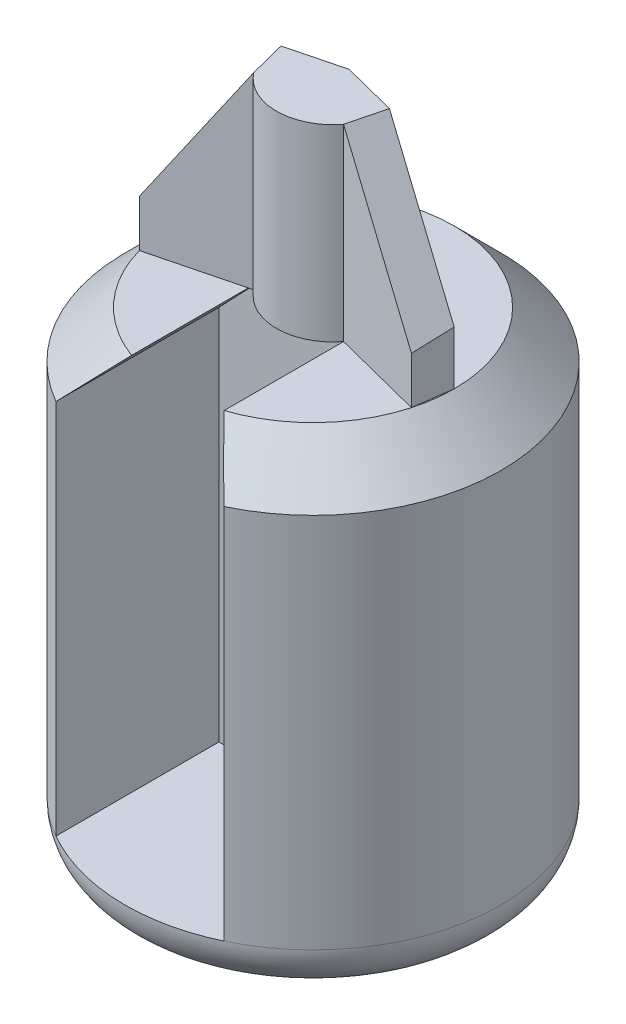
ISO-10303-21;
HEADER;
FILE_DESCRIPTION(('STEP AP214'),'2;1');
FILE_NAME('part.step','',(''),(''),'','','');
FILE_SCHEMA(('AUTOMOTIVE_DESIGN { 1 0 10303 214 1 1 1 1 }'));
ENDSEC;
DATA;
#1=APPLICATION_CONTEXT('core data for automotive mechanical design processes');
#2=APPLICATION_PROTOCOL_DEFINITION('international standard','automotive_design',2000,#1);
#3=PRODUCT_CONTEXT('',#1,'mechanical');
#4=PRODUCT('Part','Part','',(#3));
#5=PRODUCT_RELATED_PRODUCT_CATEGORY('part','',(#4));
#6=PRODUCT_DEFINITION_FORMATION('','',#4);
#7=PRODUCT_DEFINITION_CONTEXT('part definition',#1,'design');
#8=PRODUCT_DEFINITION('design','',#6,#7);
#9=PRODUCT_DEFINITION_SHAPE('','',#8);
#10=(LENGTH_UNIT() NAMED_UNIT(*) SI_UNIT(.MILLI.,.METRE.));
#11=(NAMED_UNIT(*) PLANE_ANGLE_UNIT() SI_UNIT($,.RADIAN.));
#12=(NAMED_UNIT(*) SI_UNIT($,.STERADIAN.) SOLID_ANGLE_UNIT());
#13=UNCERTAINTY_MEASURE_WITH_UNIT(LENGTH_MEASURE(1.E-05),#10,'distance_accuracy_value','');
#14=(GEOMETRIC_REPRESENTATION_CONTEXT(3) GLOBAL_UNCERTAINTY_ASSIGNED_CONTEXT((#13)) GLOBAL_UNIT_ASSIGNED_CONTEXT((#10,
#11,#12)) REPRESENTATION_CONTEXT('',''));
#15=CARTESIAN_POINT('',(0.,0.,0.));
#16=DIRECTION('',(0.,0.,1.));
#17=DIRECTION('',(1.,0.,0.));
#18=AXIS2_PLACEMENT_3D('',#15,#16,#17);
#19=CARTESIAN_POINT('',(0.,127.,0.));
#20=DIRECTION('',(0.,1.,0.));
#21=DIRECTION('',(0.,0.,1.));
#22=AXIS2_PLACEMENT_3D('',#19,#20,#21);
#23=PLANE('',#22);
#24=DIRECTION('',(0.96893064681082,0.,0.247332573008017));
#25=VECTOR('',#24,1.);
#26=CARTESIAN_POINT('',(0.,127.,0.786640961524415));
#27=LINE('',#26,#25);
#28=CARTESIAN_POINT('',(12.1095143174718,127.,3.87775728019579));
#29=VERTEX_POINT('',#28);
#30=CARTESIAN_POINT('',(36.7203527464664,127.,10.1600046345994));
#31=VERTEX_POINT('',#30);
#32=EDGE_CURVE('E211',#29,#31,#27,.T.);
#33=ORIENTED_EDGE('',*,*,#32,.F.);
#34=DIRECTION('',(0.,0.,-1.));
#35=VECTOR('',#34,1.);
#36=CARTESIAN_POINT('',(12.1095143174718,127.,50.801));
#37=LINE('',#36,#35);
#38=CARTESIAN_POINT('',(12.1095143174718,127.,36.1243638420796));
#39=VERTEX_POINT('',#38);
#40=EDGE_CURVE('E257',#39,#29,#37,.T.);
#41=ORIENTED_EDGE('',*,*,#40,.F.);
#42=CARTESIAN_POINT('',(0.,127.,0.));
#43=DIRECTION('',(0.,1.,0.));
#44=DIRECTION('',(0.,0.,1.));
#45=AXIS2_PLACEMENT_3D('',#42,#43,#44);
#46=CIRCLE('',#45,38.1);
#47=EDGE_CURVE('E189',#39,#31,#46,.T.);
#48=ORIENTED_EDGE('',*,*,#47,.T.);
#49=EDGE_LOOP('',(#33,#41,#48));
#50=FACE_BOUND('',#49,.T.);
#51=ADVANCED_FACE('F38',(#50),#23,.T.);
#52=CARTESIAN_POINT('',(-36.7203527464669,127.,10.1600046345976));
#53=VERTEX_POINT('',#52);
#54=CARTESIAN_POINT('',(-13.2904856825282,127.,35.7067639295767));
#55=VERTEX_POINT('',#54);
#56=EDGE_CURVE('E376',#53,#55,#46,.T.);
#57=ORIENTED_EDGE('',*,*,#56,.T.);
#58=DIRECTION('',(0.,0.,-1.));
#59=VECTOR('',#58,1.);
#60=CARTESIAN_POINT('',(-13.2904856825282,127.,50.801));
#61=LINE('',#60,#59);
#62=CARTESIAN_POINT('',(-13.2904856825282,127.,4.17921609701575));
#63=VERTEX_POINT('',#62);
#64=EDGE_CURVE('E152',#55,#63,#61,.T.);
#65=ORIENTED_EDGE('',*,*,#64,.T.);
#66=DIRECTION('',(0.96893064681082,0.,-0.247332573008019));
#67=VECTOR('',#66,1.);
#68=CARTESIAN_POINT('',(-36.7203527464666,127.,10.1600046345995));
#69=LINE('',#68,#67);
#70=EDGE_CURVE('E214',#53,#63,#69,.T.);
#71=ORIENTED_EDGE('',*,*,#70,.F.);
#72=EDGE_LOOP('',(#57,#65,#71));
#73=FACE_BOUND('',#72,.T.);
#74=ADVANCED_FACE('F327',(#73),#23,.T.);
#75=CARTESIAN_POINT('',(0.,127.,0.));
#76=DIRECTION('',(0.,-1.,0.));
#77=DIRECTION('',(0.,0.,-1.));
#78=AXIS2_PLACEMENT_3D('',#75,#76,#77);
#79=CYLINDRICAL_SURFACE('',#78,50.8);
#80=DIRECTION('',(0.,-1.,0.));
#81=VECTOR('',#80,1.);
#82=CARTESIAN_POINT('',(-25.4,127.,43.9940905122495));
#83=LINE('',#82,#81);
#84=CARTESIAN_POINT('',(-25.4,12.7,43.9940905122495));
#85=VERTEX_POINT('',#84);
#86=CARTESIAN_POINT('',(-25.4,114.3,43.9940905122495));
#87=VERTEX_POINT('',#86);
#88=EDGE_CURVE('E164',#85,#87,#83,.F.);
#89=ORIENTED_EDGE('',*,*,#88,.T.);
#90=CARTESIAN_POINT('',(0.,114.3,0.));
#91=DIRECTION('',(0.,1.,0.));
#92=DIRECTION('',(0.,0.,1.));
#93=AXIS2_PLACEMENT_3D('',#90,#91,#92);
#94=CIRCLE('',#93,50.8);
#95=CARTESIAN_POINT('',(21.8199678159868,114.3,45.8751458254827));
#96=VERTEX_POINT('',#95);
#97=EDGE_CURVE('E176',#87,#96,#94,.F.);
#98=ORIENTED_EDGE('',*,*,#97,.T.);
#99=DIRECTION('',(0.,-1.,0.));
#100=VECTOR('',#99,1.);
#101=CARTESIAN_POINT('',(21.8199678159868,127.,45.8751458254827));
#102=LINE('',#101,#100);
#103=CARTESIAN_POINT('',(21.8199678159868,12.7,45.8751458254827));
#104=VERTEX_POINT('',#103);
#105=EDGE_CURVE('E255',#96,#104,#102,.T.);
#106=ORIENTED_EDGE('',*,*,#105,.T.);
#107=CARTESIAN_POINT('',(0.,12.7,0.));
#108=DIRECTION('',(0.,1.,0.));
#109=DIRECTION('',(0.,0.,1.));
#110=AXIS2_PLACEMENT_3D('',#107,#108,#109);
#111=CIRCLE('',#110,50.8);
#112=EDGE_CURVE('E178',#104,#85,#111,.T.);
#113=ORIENTED_EDGE('',*,*,#112,.T.);
#114=EDGE_LOOP('',(#89,#98,#106,#113));
#115=FACE_BOUND('',#114,.T.);
#116=ADVANCED_FACE('F174',(#115),#79,.T.);
#117=CARTESIAN_POINT('',(0.,127.,0.));
#118=DIRECTION('',(0.,-1.,0.));
#119=DIRECTION('',(0.,0.,-1.));
#120=AXIS2_PLACEMENT_3D('',#117,#118,#119);
#121=CONICAL_SURFACE('',#120,38.1,0.785398163397445);
#122=ORIENTED_EDGE('',*,*,#47,.F.);
#123=CARTESIAN_POINT('',(21.8201207365143,114.2998,45.8752945612771));
#124=CARTESIAN_POINT('',(21.0039980457926,115.367181474382,45.0814372184799));
#125=CARTESIAN_POINT('',(20.1891992180709,116.432831509537,44.2838706233484));
#126=CARTESIAN_POINT('',(18.5628632959826,118.559865660278,42.6799618756017));
#127=CARTESIAN_POINT('',(17.7513260054679,119.6212500324,41.8736202618639));
#128=CARTESIAN_POINT('',(16.1320092203815,121.739104072249,40.2506896394883));
#129=CARTESIAN_POINT('',(15.3242298103603,122.795573629396,39.4341004017976));
#130=CARTESIAN_POINT('',(14.1159486519419,124.375846962074,38.2001376166085));
#131=CARTESIAN_POINT('',(13.7137405002434,124.90188248939,37.7872905849943));
#132=CARTESIAN_POINT('',(12.910579325713,125.95231200003,36.9582942072156));
#133=CARTESIAN_POINT('',(12.5096263087185,126.476705975719,36.5421448457243));
#134=CARTESIAN_POINT('',(12.1093613969443,127.0002,36.1242041656034));
#135=B_SPLINE_CURVE_WITH_KNOTS('',3,(#123,#124,#125,#126,#127,#128,#129,#130,#131,#132,#133,
#134),.UNSPECIFIED.,.F.,.F.,(4,2,2,2,2,4),(0.,4.68190155652035,9.36351720008231,
14.0452376731864,16.3862431625176,18.7272595233404),.UNSPECIFIED.);
#136=EDGE_CURVE('E157',#96,#39,#135,.T.);
#137=ORIENTED_EDGE('',*,*,#136,.F.);
#138=ORIENTED_EDGE('',*,*,#97,.F.);
#139=CARTESIAN_POINT('',(-13.2902856825282,127.000209752426,35.706614560694));
#140=CARTESIAN_POINT('',(-13.2902887821905,127.000206501617,35.7066168756634));
#141=CARTESIAN_POINT('',(-13.2902918818529,127.000203250809,35.7066191906327));
#142=CARTESIAN_POINT('',(-14.2824238126215,125.959692856796,36.447588534606));
#143=CARTESIAN_POINT('',(-15.2798792871931,124.913599330649,37.1736524222296));
#144=CARTESIAN_POINT('',(-17.2836117491208,122.812160610412,38.5998213323773));
#145=CARTESIAN_POINT('',(-18.2898891773806,121.756814953919,39.2999250482135));
#146=CARTESIAN_POINT('',(-20.3099099038406,119.638293719014,40.6773481892097));
#147=CARTESIAN_POINT('',(-21.3236536626012,118.575117657582,41.3546661942403));
#148=CARTESIAN_POINT('',(-23.3574265450475,116.442173682562,42.6890670600221));
#149=CARTESIAN_POINT('',(-24.3774554978278,115.372405948212,43.3461504680991));
#150=CARTESIAN_POINT('',(-25.4001938006752,114.299796749191,43.9942133150667));
#151=CARTESIAN_POINT('',(-25.4001969003376,114.299793498383,43.994215279182));
#152=CARTESIAN_POINT('',(-25.4002,114.299790247574,43.9942172432972));
#153=B_SPLINE_CURVE_WITH_KNOTS('',3,(#139,#140,#141,#142,#143,#144,#145,#146,#147,#148,#149,
#150,#151,#152),.UNSPECIFIED.,.F.,.F.,(4,2,2,2,2,2,4),(0.,1.51595748955515E-05,4.85223751976194,
9.70470378272431,14.5574719195883,19.4101086783826,19.4101233855476),.UNSPECIFIED.);
#154=EDGE_CURVE('E144',#55,#87,#153,.T.);
#155=ORIENTED_EDGE('',*,*,#154,.F.);
#156=ORIENTED_EDGE('',*,*,#56,.F.);
#157=CARTESIAN_POINT('',(-38.1,127.,4.6345994758959E-06));
#158=VERTEX_POINT('',#157);
#159=EDGE_CURVE('E353',#158,#53,#46,.T.);
#160=ORIENTED_EDGE('',*,*,#159,.F.);
#161=CARTESIAN_POINT('',(38.0999999999998,127.,4.63460114383252E-06));
#162=VERTEX_POINT('',#161);
#163=EDGE_CURVE('E187',#162,#158,#46,.T.);
#164=ORIENTED_EDGE('',*,*,#163,.F.);
#165=EDGE_CURVE('E183',#31,#162,#46,.T.);
#166=ORIENTED_EDGE('',*,*,#165,.F.);
#167=EDGE_LOOP('',(#122,#137,#138,#155,#156,#160,#164,#166));
#168=FACE_BOUND('',#167,.T.);
#169=ADVANCED_FACE('F41',(#168),#121,.T.);
#170=CARTESIAN_POINT('',(0.,177.8,0.786640961524415));
#171=DIRECTION('',(0.247332573008017,0.,-0.96893064681082));
#172=DIRECTION('',(-0.96893064681082,0.,-0.247332573008017));
#173=AXIS2_PLACEMENT_3D('',#170,#171,#172);
#174=PLANE('',#173);
#175=DIRECTION('',(0.,-1.,0.));
#176=VECTOR('',#175,1.);
#177=CARTESIAN_POINT('',(12.1095143174718,177.8,3.87775728019579));
#178=LINE('',#177,#176);
#179=CARTESIAN_POINT('',(12.1095143174718,177.8,3.87775728019579));
#180=VERTEX_POINT('',#179);
#181=EDGE_CURVE('E242',#180,#29,#178,.T.);
#182=ORIENTED_EDGE('',*,*,#181,.T.);
#183=ORIENTED_EDGE('',*,*,#32,.T.);
#184=DIRECTION('',(0.,-1.,0.));
#185=VECTOR('',#184,1.);
#186=CARTESIAN_POINT('',(36.7203527464667,177.8,10.1600046345994));
#187=LINE('',#186,#185);
#188=CARTESIAN_POINT('',(36.7203527464667,139.7,10.1600046345994));
#189=VERTEX_POINT('',#188);
#190=EDGE_CURVE('E201',#189,#31,#187,.T.);
#191=ORIENTED_EDGE('',*,*,#190,.F.);
#192=DIRECTION('',(-0.5374660199146,0.832050294337844,-0.137195426780438));
#193=VECTOR('',#192,1.);
#194=CARTESIAN_POINT('',(36.7203527464667,139.7,10.1600046345994));
#195=LINE('',#194,#193);
#196=EDGE_CURVE('E239',#189,#180,#195,.T.);
#197=ORIENTED_EDGE('',*,*,#196,.T.);
#198=EDGE_LOOP('',(#182,#183,#191,#197));
#199=FACE_BOUND('',#198,.T.);
#200=ADVANCED_FACE('F373',(#199),#174,.F.);
#201=CARTESIAN_POINT('',(-36.7203527464666,177.8,10.1600046345995));
#202=DIRECTION('',(-0.247332573008019,0.,-0.96893064681082));
#203=DIRECTION('',(-0.96893064681082,0.,0.247332573008019));
#204=AXIS2_PLACEMENT_3D('',#201,#202,#203);
#205=PLANE('',#204);
#206=DIRECTION('',(0.,-1.,0.));
#207=VECTOR('',#206,1.);
#208=CARTESIAN_POINT('',(-12.1095143174718,177.8,3.8777572801958));
#209=LINE('',#208,#207);
#210=CARTESIAN_POINT('',(-12.1095143174718,177.8,3.8777572801958));
#211=VERTEX_POINT('',#210);
#212=CARTESIAN_POINT('',(-12.1095143174718,127.,3.8777572801958));
#213=VERTEX_POINT('',#212);
#214=EDGE_CURVE('E245',#211,#213,#209,.T.);
#215=ORIENTED_EDGE('',*,*,#214,.F.);
#216=DIRECTION('',(0.5374660199146,0.832050294337844,-0.137195426780439));
#217=VECTOR('',#216,1.);
#218=CARTESIAN_POINT('',(-12.1095143174718,177.8,3.8777572801958));
#219=LINE('',#218,#217);
#220=CARTESIAN_POINT('',(-36.7203527464666,139.7,10.1600046345995));
#221=VERTEX_POINT('',#220);
#222=EDGE_CURVE('E233',#221,#211,#219,.T.);
#223=ORIENTED_EDGE('',*,*,#222,.F.);
#224=DIRECTION('',(0.,-1.,0.));
#225=VECTOR('',#224,1.);
#226=CARTESIAN_POINT('',(-36.7203527464666,177.8,10.1600046345995));
#227=LINE('',#226,#225);
#228=EDGE_CURVE('E199',#221,#53,#227,.T.);
#229=ORIENTED_EDGE('',*,*,#228,.T.);
#230=ORIENTED_EDGE('',*,*,#70,.T.);
#231=DIRECTION('',(-0.96893064681082,0.,0.247332573008019));
#232=VECTOR('',#231,1.);
#233=CARTESIAN_POINT('',(-36.7203527464666,127.,10.1600046345995));
#234=LINE('',#233,#232);
#235=EDGE_CURVE('E252',#213,#63,#234,.T.);
#236=ORIENTED_EDGE('',*,*,#235,.F.);
#237=EDGE_LOOP('',(#215,#223,#229,#230,#236));
#238=FACE_BOUND('',#237,.T.);
#239=ADVANCED_FACE('F381',(#238),#205,.F.);
#240=CARTESIAN_POINT('',(38.1,177.8,4.63459942905836E-06));
#241=DIRECTION('',(-0.247332573008014,0.,0.968930646810821));
#242=DIRECTION('',(0.968930646810821,0.,0.247332573008014));
#243=AXIS2_PLACEMENT_3D('',#240,#241,#242);
#244=PLANE('',#243);
#245=DIRECTION('',(-0.537466019914601,0.832050294337844,-0.137195426780436));
#246=VECTOR('',#245,1.);
#247=CARTESIAN_POINT('',(21.8506639592912,166.619746047396,-4.14785683087143));
#248=LINE('',#247,#246);
#249=CARTESIAN_POINT('',(38.1,141.464174654037,4.634599428191E-06));
#250=VERTEX_POINT('',#249);
#251=CARTESIAN_POINT('',(14.6287368300874,177.8,-5.99135081552514));
#252=VERTEX_POINT('',#251);
#253=EDGE_CURVE('E53',#250,#252,#248,.T.);
#254=ORIENTED_EDGE('',*,*,#253,.F.);
#255=DIRECTION('',(0.,-1.,0.));
#256=VECTOR('',#255,1.);
#257=CARTESIAN_POINT('',(38.1,177.8,4.63459942905836E-06));
#258=LINE('',#257,#256);
#259=EDGE_CURVE('E204',#250,#162,#258,.T.);
#260=ORIENTED_EDGE('',*,*,#259,.T.);
#261=DIRECTION('',(-0.968930646810821,0.,-0.247332573008014));
#262=VECTOR('',#261,1.);
#263=CARTESIAN_POINT('',(38.1,127.,4.63459942905836E-06));
#264=LINE('',#263,#262);
#265=CARTESIAN_POINT('',(0.,127.,-9.72553254664447));
#266=VERTEX_POINT('',#265);
#267=EDGE_CURVE('E221',#162,#266,#264,.T.);
#268=ORIENTED_EDGE('',*,*,#267,.T.);
#269=DIRECTION('',(0.,-1.,0.));
#270=VECTOR('',#269,1.);
#271=CARTESIAN_POINT('',(0.,177.8,-9.72553254664447));
#272=LINE('',#271,#270);
#273=CARTESIAN_POINT('',(0.,177.8,-9.72553254664447));
#274=VERTEX_POINT('',#273);
#275=EDGE_CURVE('E195',#274,#266,#272,.T.);
#276=ORIENTED_EDGE('',*,*,#275,.F.);
#277=DIRECTION('',(-0.968930646810821,0.,-0.247332573008014));
#278=VECTOR('',#277,1.);
#279=CARTESIAN_POINT('',(38.1,177.8,4.63459942905836E-06));
#280=LINE('',#279,#278);
#281=EDGE_CURVE('E210',#252,#274,#280,.T.);
#282=ORIENTED_EDGE('',*,*,#281,.F.);
#283=EDGE_LOOP('',(#254,#260,#268,#276,#282));
#284=FACE_BOUND('',#283,.T.);
#285=ADVANCED_FACE('F363',(#284),#244,.F.);
#286=CARTESIAN_POINT('',(36.7203527464667,177.8,10.1600046345994));
#287=DIRECTION('',(-0.99090583648456,0.,-0.134557137383473));
#288=DIRECTION('',(-0.134557137383473,0.,0.99090583648456));
#289=AXIS2_PLACEMENT_3D('',#286,#287,#288);
#290=PLANE('',#289);
#291=DIRECTION('',(0.132608536831673,0.169568430617476,-0.976555949906245));
#292=VECTOR('',#291,1.);
#293=CARTESIAN_POINT('',(37.5770777847414,140.795506546425,3.85090905485694));
#294=LINE('',#293,#292);
#295=EDGE_CURVE('E237',#189,#250,#294,.T.);
#296=ORIENTED_EDGE('',*,*,#295,.F.);
#297=ORIENTED_EDGE('',*,*,#190,.T.);
#298=DIRECTION('',(0.134557137383473,0.,-0.99090583648456));
#299=VECTOR('',#298,1.);
#300=CARTESIAN_POINT('',(36.7203527464667,127.,10.1600046345994));
#301=LINE('',#300,#299);
#302=EDGE_CURVE('E207',#31,#162,#301,.T.);
#303=ORIENTED_EDGE('',*,*,#302,.T.);
#304=ORIENTED_EDGE('',*,*,#259,.F.);
#305=EDGE_LOOP('',(#296,#297,#303,#304));
#306=FACE_BOUND('',#305,.T.);
#307=ADVANCED_FACE('F370',(#306),#290,.F.);
#308=CARTESIAN_POINT('',(0.,177.8,0.));
#309=DIRECTION('',(0.,-1.,0.));
#310=DIRECTION('',(0.,0.,-1.));
#311=AXIS2_PLACEMENT_3D('',#308,#309,#310);
#312=PLANE('',#311);
#313=CARTESIAN_POINT('',(0.,177.8,-5.37520240819283));
#314=DIRECTION('',(0.,1.,0.));
#315=DIRECTION('',(0.,0.,1.));
#316=AXIS2_PLACEMENT_3D('',#313,#314,#315);
#317=CIRCLE('',#316,15.24);
#318=EDGE_CURVE('E248',#211,#180,#317,.T.);
#319=ORIENTED_EDGE('',*,*,#318,.T.);
#320=DIRECTION('',(-0.247332573008017,0.,0.96893064681082));
#321=VECTOR('',#320,1.);
#322=CARTESIAN_POINT('',(12.2980313371042,177.8,3.13923782218139));
#323=LINE('',#322,#321);
#324=EDGE_CURVE('E11',#252,#180,#323,.T.);
#325=ORIENTED_EDGE('',*,*,#324,.F.);
#326=ORIENTED_EDGE('',*,*,#281,.T.);
#327=DIRECTION('',(-0.96893064681082,0.,0.247332573008015));
#328=VECTOR('',#327,1.);
#329=CARTESIAN_POINT('',(0.,177.8,-9.72553254664447));
#330=LINE('',#329,#328);
#331=CARTESIAN_POINT('',(-14.6287368300873,177.8,-5.99135081552513));
#332=VERTEX_POINT('',#331);
#333=EDGE_CURVE('E206',#274,#332,#330,.T.);
#334=ORIENTED_EDGE('',*,*,#333,.T.);
#335=DIRECTION('',(0.247332573008019,0.,0.96893064681082));
#336=VECTOR('',#335,1.);
#337=CARTESIAN_POINT('',(-12.2980313371042,177.8,3.13923782218141));
#338=LINE('',#337,#336);
#339=EDGE_CURVE('E47',#332,#211,#338,.T.);
#340=ORIENTED_EDGE('',*,*,#339,.T.);
#341=EDGE_LOOP('',(#319,#325,#326,#334,#340));
#342=FACE_BOUND('',#341,.T.);
#343=ADVANCED_FACE('F387',(#342),#312,.F.);
#344=ORIENTED_EDGE('',*,*,#267,.F.);
#345=ORIENTED_EDGE('',*,*,#163,.T.);
#346=DIRECTION('',(-0.96893064681082,0.,0.247332573008015));
#347=VECTOR('',#346,1.);
#348=CARTESIAN_POINT('',(0.,127.,-9.72553254664447));
#349=LINE('',#348,#347);
#350=EDGE_CURVE('E61',#266,#158,#349,.T.);
#351=ORIENTED_EDGE('',*,*,#350,.F.);
#352=EDGE_LOOP('',(#344,#345,#351));
#353=FACE_BOUND('',#352,.T.);
#354=ADVANCED_FACE('F335',(#353),#23,.T.);
#355=ORIENTED_EDGE('',*,*,#302,.F.);
#356=ORIENTED_EDGE('',*,*,#165,.T.);
#357=EDGE_LOOP('',(#355,#356));
#358=FACE_BOUND('',#357,.T.);
#359=ADVANCED_FACE('F341',(#358),#23,.T.);
#360=DIRECTION('',(0.134557137383476,0.,0.99090583648456));
#361=VECTOR('',#360,1.);
#362=CARTESIAN_POINT('',(-38.1,127.,4.6345994758959E-06));
#363=LINE('',#362,#361);
#364=EDGE_CURVE('E217',#158,#53,#363,.T.);
#365=ORIENTED_EDGE('',*,*,#364,.F.);
#366=ORIENTED_EDGE('',*,*,#159,.T.);
#367=EDGE_LOOP('',(#365,#366));
#368=FACE_BOUND('',#367,.T.);
#369=ADVANCED_FACE('F330',(#368),#23,.T.);
#370=CARTESIAN_POINT('',(0.,0.,0.));
#371=DIRECTION('',(0.,1.,0.));
#372=DIRECTION('',(0.,0.,1.));
#373=AXIS2_PLACEMENT_3D('',#370,#371,#372);
#374=PLANE('',#373);
#375=CARTESIAN_POINT('',(0.,0.,0.));
#376=DIRECTION('',(0.,1.,0.));
#377=DIRECTION('',(0.,0.,1.));
#378=AXIS2_PLACEMENT_3D('',#375,#376,#377);
#379=CIRCLE('',#378,38.1);
#380=CARTESIAN_POINT('',(0.,0.,38.1));
#381=VERTEX_POINT('',#380);
#382=EDGE_CURVE('E191',#381,#381,#379,.F.);
#383=ORIENTED_EDGE('',*,*,#382,.T.);
#384=EDGE_LOOP('',(#383));
#385=FACE_BOUND('',#384,.T.);
#386=ADVANCED_FACE('F340',(#385),#374,.F.);
#387=CARTESIAN_POINT('',(0.,12.7,0.));
#388=DIRECTION('',(0.,1.,0.));
#389=DIRECTION('',(0.,0.,1.));
#390=AXIS2_PLACEMENT_3D('',#387,#388,#389);
#391=TOROIDAL_SURFACE('',#390,38.1,12.7);
#392=ORIENTED_EDGE('',*,*,#382,.F.);
#393=EDGE_LOOP('',(#392));
#394=FACE_BOUND('',#393,.T.);
#395=ORIENTED_EDGE('',*,*,#112,.F.);
#396=CARTESIAN_POINT('',(0.,12.7,0.));
#397=DIRECTION('',(0.,1.,0.));
#398=DIRECTION('',(0.,0.,1.));
#399=AXIS2_PLACEMENT_3D('',#396,#397,#398);
#400=CIRCLE('',#399,50.8);
#401=EDGE_CURVE('E158',#85,#104,#400,.T.);
#402=ORIENTED_EDGE('',*,*,#401,.F.);
#403=EDGE_LOOP('',(#395,#402));
#404=FACE_BOUND('',#403,.T.);
#405=ADVANCED_FACE('F347',(#394,#404),#391,.T.);
#406=CARTESIAN_POINT('',(0.,177.8,-9.72553254664447));
#407=DIRECTION('',(0.247332573008015,0.,0.968930646810821));
#408=DIRECTION('',(0.968930646810821,0.,-0.247332573008015));
#409=AXIS2_PLACEMENT_3D('',#406,#407,#408);
#410=PLANE('',#409);
#411=DIRECTION('',(0.,-1.,0.));
#412=VECTOR('',#411,1.);
#413=CARTESIAN_POINT('',(-38.1,177.8,4.6345994758959E-06));
#414=LINE('',#413,#412);
#415=CARTESIAN_POINT('',(-38.1,141.464174654037,4.6345994758959E-06));
#416=VERTEX_POINT('',#415);
#417=EDGE_CURVE('E197',#416,#158,#414,.T.);
#418=ORIENTED_EDGE('',*,*,#417,.F.);
#419=DIRECTION('',(0.5374660199146,0.832050294337844,-0.137195426780437));
#420=VECTOR('',#419,1.);
#421=CARTESIAN_POINT('',(-10.1275870362143,184.768222868203,-7.14032980971569));
#422=LINE('',#421,#420);
#423=EDGE_CURVE('E224',#416,#332,#422,.T.);
#424=ORIENTED_EDGE('',*,*,#423,.T.);
#425=ORIENTED_EDGE('',*,*,#333,.F.);
#426=ORIENTED_EDGE('',*,*,#275,.T.);
#427=ORIENTED_EDGE('',*,*,#350,.T.);
#428=EDGE_LOOP('',(#418,#424,#425,#426,#427));
#429=FACE_BOUND('',#428,.T.);
#430=ADVANCED_FACE('F358',(#429),#410,.F.);
#431=CARTESIAN_POINT('',(-38.1,177.8,4.6345994758959E-06));
#432=DIRECTION('',(0.990905836484559,0.,-0.134557137383476));
#433=DIRECTION('',(-0.134557137383476,0.,-0.990905836484559));
#434=AXIS2_PLACEMENT_3D('',#431,#432,#433);
#435=PLANE('',#434);
#436=ORIENTED_EDGE('',*,*,#228,.F.);
#437=DIRECTION('',(-0.132608536831676,0.169568430617474,-0.976555949906245));
#438=VECTOR('',#437,1.);
#439=CARTESIAN_POINT('',(-38.9170554162799,142.508955088059,-6.01695586609627));
#440=LINE('',#439,#438);
#441=EDGE_CURVE('E230',#221,#416,#440,.T.);
#442=ORIENTED_EDGE('',*,*,#441,.T.);
#443=ORIENTED_EDGE('',*,*,#417,.T.);
#444=ORIENTED_EDGE('',*,*,#364,.T.);
#445=EDGE_LOOP('',(#436,#442,#443,#444));
#446=FACE_BOUND('',#445,.T.);
#447=ADVANCED_FACE('F383',(#446),#435,.F.);
#448=CARTESIAN_POINT('',(-27.5797641270349,177.8,-56.7272773579995));
#449=DIRECTION('',(0.8061990298719,-0.554700196225229,-0.205793140170658));
#450=DIRECTION('',(0.566832963460321,0.823832744878953,0.));
#451=AXIS2_PLACEMENT_3D('',#448,#449,#450);
#452=PLANE('',#451);
#453=ORIENTED_EDGE('',*,*,#441,.F.);
#454=ORIENTED_EDGE('',*,*,#222,.T.);
#455=ORIENTED_EDGE('',*,*,#339,.F.);
#456=ORIENTED_EDGE('',*,*,#423,.F.);
#457=EDGE_LOOP('',(#453,#454,#455,#456));
#458=FACE_BOUND('',#457,.T.);
#459=ADVANCED_FACE('F385',(#458),#452,.F.);
#460=CARTESIAN_POINT('',(52.1906025560297,139.7,-50.4450300035958));
#461=DIRECTION('',(0.8061990298719,0.554700196225229,0.205793140170657));
#462=DIRECTION('',(-0.566832963460321,0.823832744878954,0.));
#463=AXIS2_PLACEMENT_3D('',#460,#461,#462);
#464=PLANE('',#463);
#465=ORIENTED_EDGE('',*,*,#253,.T.);
#466=ORIENTED_EDGE('',*,*,#324,.T.);
#467=ORIENTED_EDGE('',*,*,#196,.F.);
#468=ORIENTED_EDGE('',*,*,#295,.T.);
#469=EDGE_LOOP('',(#465,#466,#467,#468));
#470=FACE_BOUND('',#469,.T.);
#471=ADVANCED_FACE('F324',(#470),#464,.T.);
#472=CARTESIAN_POINT('',(0.,177.8,-5.37520240819283));
#473=DIRECTION('',(0.,-1.,0.));
#474=DIRECTION('',(0.,0.,-1.));
#475=AXIS2_PLACEMENT_3D('',#472,#473,#474);
#476=CYLINDRICAL_SURFACE('',#475,15.24);
#477=CARTESIAN_POINT('',(0.,127.,-5.37520240819283));
#478=DIRECTION('',(0.,1.,0.));
#479=DIRECTION('',(0.,0.,1.));
#480=AXIS2_PLACEMENT_3D('',#477,#478,#479);
#481=CIRCLE('',#480,15.24);
#482=EDGE_CURVE('E249',#213,#29,#481,.T.);
#483=ORIENTED_EDGE('',*,*,#482,.T.);
#484=ORIENTED_EDGE('',*,*,#181,.F.);
#485=ORIENTED_EDGE('',*,*,#318,.F.);
#486=ORIENTED_EDGE('',*,*,#214,.T.);
#487=EDGE_LOOP('',(#483,#484,#485,#486));
#488=FACE_BOUND('',#487,.T.);
#489=ADVANCED_FACE('F319',(#488),#476,.T.);
#490=CARTESIAN_POINT('',(12.1095143174718,127.,50.801));
#491=DIRECTION('',(0.,-1.,0.));
#492=DIRECTION('',(0.,0.,-1.));
#493=AXIS2_PLACEMENT_3D('',#490,#491,#492);
#494=PLANE('',#493);
#495=ORIENTED_EDGE('',*,*,#235,.T.);
#496=CARTESIAN_POINT('',(-13.2904856825282,127.,0.));
#497=VERTEX_POINT('',#496);
#498=EDGE_CURVE('E168',#63,#497,#61,.T.);
#499=ORIENTED_EDGE('',*,*,#498,.T.);
#500=DIRECTION('',(-1.,0.,0.));
#501=VECTOR('',#500,1.);
#502=CARTESIAN_POINT('',(12.1095143174718,127.,0.));
#503=LINE('',#502,#501);
#504=CARTESIAN_POINT('',(12.1095143174718,127.,0.));
#505=VERTEX_POINT('',#504);
#506=EDGE_CURVE('E275',#505,#497,#503,.T.);
#507=ORIENTED_EDGE('',*,*,#506,.F.);
#508=EDGE_CURVE('E259',#29,#505,#37,.T.);
#509=ORIENTED_EDGE('',*,*,#508,.F.);
#510=ORIENTED_EDGE('',*,*,#482,.F.);
#511=EDGE_LOOP('',(#495,#499,#507,#509,#510));
#512=FACE_BOUND('',#511,.T.);
#513=ADVANCED_FACE('F315',(#512),#494,.T.);
#514=CARTESIAN_POINT('',(-25.4,114.3,50.801));
#515=DIRECTION('',(1.,0.,0.));
#516=DIRECTION('',(0.,1.,0.));
#517=AXIS2_PLACEMENT_3D('',#514,#515,#516);
#518=PLANE('',#517);
#519=DIRECTION('',(0.,0.,-1.));
#520=VECTOR('',#519,1.);
#521=CARTESIAN_POINT('',(-25.4,12.7,50.801));
#522=LINE('',#521,#520);
#523=CARTESIAN_POINT('',(-25.4,12.7,0.));
#524=VERTEX_POINT('',#523);
#525=EDGE_CURVE('E169',#85,#524,#522,.T.);
#526=ORIENTED_EDGE('',*,*,#525,.T.);
#527=DIRECTION('',(0.,-1.,0.));
#528=VECTOR('',#527,1.);
#529=CARTESIAN_POINT('',(-25.4,114.3,0.));
#530=LINE('',#529,#528);
#531=CARTESIAN_POINT('',(-25.4,114.3,0.));
#532=VERTEX_POINT('',#531);
#533=EDGE_CURVE('E167',#532,#524,#530,.T.);
#534=ORIENTED_EDGE('',*,*,#533,.F.);
#535=DIRECTION('',(0.,0.,-1.));
#536=VECTOR('',#535,1.);
#537=CARTESIAN_POINT('',(-25.4,114.3,50.801));
#538=LINE('',#537,#536);
#539=EDGE_CURVE('E148',#87,#532,#538,.T.);
#540=ORIENTED_EDGE('',*,*,#539,.F.);
#541=ORIENTED_EDGE('',*,*,#88,.F.);
#542=EDGE_LOOP('',(#526,#534,#540,#541));
#543=FACE_BOUND('',#542,.T.);
#544=ADVANCED_FACE('F163',(#543),#518,.T.);
#545=CARTESIAN_POINT('',(-25.4,12.7,50.801));
#546=DIRECTION('',(0.,1.,0.));
#547=DIRECTION('',(0.,0.,1.));
#548=AXIS2_PLACEMENT_3D('',#545,#546,#547);
#549=PLANE('',#548);
#550=ORIENTED_EDGE('',*,*,#401,.T.);
#551=DIRECTION('',(0.,0.,-1.));
#552=VECTOR('',#551,1.);
#553=CARTESIAN_POINT('',(21.8199678159868,12.7,50.801));
#554=LINE('',#553,#552);
#555=CARTESIAN_POINT('',(21.8199678159868,12.7,0.));
#556=VERTEX_POINT('',#555);
#557=EDGE_CURVE('E262',#104,#556,#554,.T.);
#558=ORIENTED_EDGE('',*,*,#557,.T.);
#559=DIRECTION('',(1.,0.,0.));
#560=VECTOR('',#559,1.);
#561=CARTESIAN_POINT('',(-25.4,12.7,0.));
#562=LINE('',#561,#560);
#563=EDGE_CURVE('E269',#524,#556,#562,.T.);
#564=ORIENTED_EDGE('',*,*,#563,.F.);
#565=ORIENTED_EDGE('',*,*,#525,.F.);
#566=EDGE_LOOP('',(#550,#558,#564,#565));
#567=FACE_BOUND('',#566,.T.);
#568=ADVANCED_FACE('F309',(#567),#549,.T.);
#569=CARTESIAN_POINT('',(21.8199678159868,12.7,50.801));
#570=DIRECTION('',(-1.,0.,0.));
#571=DIRECTION('',(0.,-1.,0.));
#572=AXIS2_PLACEMENT_3D('',#569,#570,#571);
#573=PLANE('',#572);
#574=DIRECTION('',(0.,0.,-1.));
#575=VECTOR('',#574,1.);
#576=CARTESIAN_POINT('',(21.8199678159868,114.3,50.801));
#577=LINE('',#576,#575);
#578=CARTESIAN_POINT('',(21.8199678159868,114.3,0.));
#579=VERTEX_POINT('',#578);
#580=EDGE_CURVE('E264',#96,#579,#577,.T.);
#581=ORIENTED_EDGE('',*,*,#580,.T.);
#582=DIRECTION('',(0.,1.,0.));
#583=VECTOR('',#582,1.);
#584=CARTESIAN_POINT('',(21.8199678159868,12.7,0.));
#585=LINE('',#584,#583);
#586=EDGE_CURVE('E266',#556,#579,#585,.T.);
#587=ORIENTED_EDGE('',*,*,#586,.F.);
#588=ORIENTED_EDGE('',*,*,#557,.F.);
#589=ORIENTED_EDGE('',*,*,#105,.F.);
#590=EDGE_LOOP('',(#581,#587,#588,#589));
#591=FACE_BOUND('',#590,.T.);
#592=ADVANCED_FACE('F306',(#591),#573,.T.);
#593=CARTESIAN_POINT('',(21.8199678159868,114.3,50.801));
#594=DIRECTION('',(-0.794397407325591,-0.607398353005982,0.));
#595=DIRECTION('',(0.607398353005982,-0.794397407325591,0.));
#596=AXIS2_PLACEMENT_3D('',#593,#594,#595);
#597=PLANE('',#596);
#598=ORIENTED_EDGE('',*,*,#136,.T.);
#599=ORIENTED_EDGE('',*,*,#40,.T.);
#600=ORIENTED_EDGE('',*,*,#508,.T.);
#601=DIRECTION('',(-0.607398353005982,0.794397407325591,0.));
#602=VECTOR('',#601,1.);
#603=CARTESIAN_POINT('',(21.8199678159868,114.3,0.));
#604=LINE('',#603,#602);
#605=EDGE_CURVE('E179',#579,#505,#604,.T.);
#606=ORIENTED_EDGE('',*,*,#605,.F.);
#607=ORIENTED_EDGE('',*,*,#580,.F.);
#608=EDGE_LOOP('',(#598,#599,#600,#606,#607));
#609=FACE_BOUND('',#608,.T.);
#610=ADVANCED_FACE('F292',(#609),#597,.T.);
#611=CARTESIAN_POINT('',(-13.2904856825282,127.,50.801));
#612=DIRECTION('',(0.723731511420929,-0.690081661382461,0.));
#613=DIRECTION('',(0.690081661382461,0.72373151142093,0.));
#614=AXIS2_PLACEMENT_3D('',#611,#612,#613);
#615=PLANE('',#614);
#616=ORIENTED_EDGE('',*,*,#154,.T.);
#617=ORIENTED_EDGE('',*,*,#539,.T.);
#618=DIRECTION('',(-0.690081661382461,-0.72373151142093,0.));
#619=VECTOR('',#618,1.);
#620=CARTESIAN_POINT('',(-13.2904856825282,127.,0.));
#621=LINE('',#620,#619);
#622=EDGE_CURVE('E273',#497,#532,#621,.T.);
#623=ORIENTED_EDGE('',*,*,#622,.F.);
#624=ORIENTED_EDGE('',*,*,#498,.F.);
#625=ORIENTED_EDGE('',*,*,#64,.F.);
#626=EDGE_LOOP('',(#616,#617,#623,#624,#625));
#627=FACE_BOUND('',#626,.T.);
#628=ADVANCED_FACE('F146',(#627),#615,.T.);
#629=CARTESIAN_POINT('',(0.,0.,0.));
#630=DIRECTION('',(0.,0.,1.));
#631=DIRECTION('',(1.,0.,0.));
#632=AXIS2_PLACEMENT_3D('',#629,#630,#631);
#633=PLANE('',#632);
#634=ORIENTED_EDGE('',*,*,#605,.T.);
#635=ORIENTED_EDGE('',*,*,#506,.T.);
#636=ORIENTED_EDGE('',*,*,#622,.T.);
#637=ORIENTED_EDGE('',*,*,#533,.T.);
#638=ORIENTED_EDGE('',*,*,#563,.T.);
#639=ORIENTED_EDGE('',*,*,#586,.T.);
#640=EDGE_LOOP('',(#634,#635,#636,#637,#638,#639));
#641=FACE_BOUND('',#640,.T.);
#642=ADVANCED_FACE('F301',(#641),#633,.T.);
#643=CLOSED_SHELL('',(#51,#74,#116,#169,#200,#239,#285,#307,#343,#354,#359,#369,#386,#405,#430,
#447,#459,#471,#489,#513,#544,#568,#592,#610,#628,#642));
#644=MANIFOLD_SOLID_BREP('B2',#643);
#645=ADVANCED_BREP_SHAPE_REPRESENTATION('',(#18,#644),#14);
#646=SHAPE_DEFINITION_REPRESENTATION(#9,#645);
ENDSEC;
END-ISO-10303-21;
